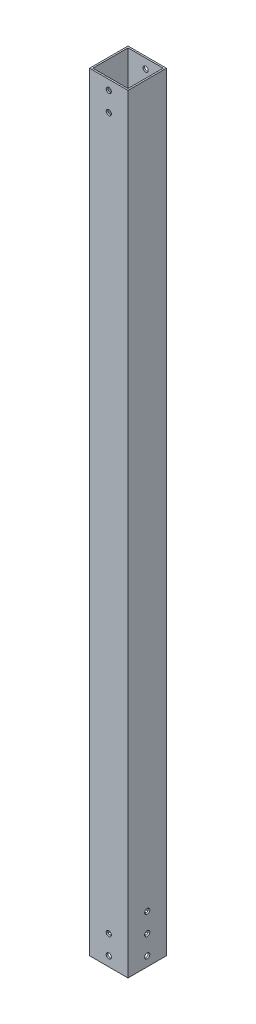
ISO-10303-21;
HEADER;
FILE_DESCRIPTION(('STEP AP214'),'2;1');
FILE_NAME('part.step','',(''),(''),'','','');
FILE_SCHEMA(('AUTOMOTIVE_DESIGN { 1 0 10303 214 1 1 1 1 }'));
ENDSEC;
DATA;
#1=APPLICATION_CONTEXT('core data for automotive mechanical design processes');
#2=APPLICATION_PROTOCOL_DEFINITION('international standard','automotive_design',2000,#1);
#3=PRODUCT_CONTEXT('',#1,'mechanical');
#4=PRODUCT('Part','Part','',(#3));
#5=PRODUCT_RELATED_PRODUCT_CATEGORY('part','',(#4));
#6=PRODUCT_DEFINITION_FORMATION('','',#4);
#7=PRODUCT_DEFINITION_CONTEXT('part definition',#1,'design');
#8=PRODUCT_DEFINITION('design','',#6,#7);
#9=PRODUCT_DEFINITION_SHAPE('','',#8);
#10=(LENGTH_UNIT() NAMED_UNIT(*) SI_UNIT(.MILLI.,.METRE.));
#11=(NAMED_UNIT(*) PLANE_ANGLE_UNIT() SI_UNIT($,.RADIAN.));
#12=(NAMED_UNIT(*) SI_UNIT($,.STERADIAN.) SOLID_ANGLE_UNIT());
#13=UNCERTAINTY_MEASURE_WITH_UNIT(LENGTH_MEASURE(1.E-05),#10,'distance_accuracy_value','');
#14=(GEOMETRIC_REPRESENTATION_CONTEXT(3) GLOBAL_UNCERTAINTY_ASSIGNED_CONTEXT((#13)) GLOBAL_UNIT_ASSIGNED_CONTEXT((#10,
#11,#12)) REPRESENTATION_CONTEXT('',''));
#15=CARTESIAN_POINT('',(0.,0.,0.));
#16=DIRECTION('',(0.,0.,1.));
#17=DIRECTION('',(1.,0.,0.));
#18=AXIS2_PLACEMENT_3D('',#15,#16,#17);
#19=CARTESIAN_POINT('',(-19.05,47.625,0.));
#20=DIRECTION('',(1.,0.,0.));
#21=DIRECTION('',(0.,0.,-1.));
#22=AXIS2_PLACEMENT_3D('',#19,#20,#21);
#23=CYLINDRICAL_SURFACE('',#22,2.5527);
#24=CARTESIAN_POINT('',(-17.4625,47.625,0.));
#25=DIRECTION('',(1.,0.,0.));
#26=DIRECTION('',(0.,0.,-1.));
#27=AXIS2_PLACEMENT_3D('',#24,#25,#26);
#28=CIRCLE('',#27,2.5527);
#29=CARTESIAN_POINT('',(-17.4625,47.625,-2.5527));
#30=VERTEX_POINT('',#29);
#31=EDGE_CURVE('E315',#30,#30,#28,.T.);
#32=ORIENTED_EDGE('',*,*,#31,.T.);
#33=EDGE_LOOP('',(#32));
#34=FACE_BOUND('',#33,.T.);
#35=CARTESIAN_POINT('',(-19.05,47.625,0.));
#36=DIRECTION('',(1.,0.,0.));
#37=DIRECTION('',(0.,0.,-1.));
#38=AXIS2_PLACEMENT_3D('',#35,#36,#37);
#39=CIRCLE('',#38,2.5527);
#40=CARTESIAN_POINT('',(-19.05,47.625,-2.5527));
#41=VERTEX_POINT('',#40);
#42=EDGE_CURVE('E312',#41,#41,#39,.T.);
#43=ORIENTED_EDGE('',*,*,#42,.F.);
#44=EDGE_LOOP('',(#43));
#45=FACE_BOUND('',#44,.T.);
#46=ADVANCED_FACE('F16',(#34,#45),#23,.F.);
#47=CARTESIAN_POINT('',(-19.05,47.625,0.));
#48=DIRECTION('',(1.,0.,0.));
#49=DIRECTION('',(0.,0.,-1.));
#50=AXIS2_PLACEMENT_3D('',#47,#48,#49);
#51=CYLINDRICAL_SURFACE('',#50,2.5527);
#52=CARTESIAN_POINT('',(17.4625,47.625,0.));
#53=DIRECTION('',(-1.,0.,0.));
#54=DIRECTION('',(0.,0.,1.));
#55=AXIS2_PLACEMENT_3D('',#52,#53,#54);
#56=CIRCLE('',#55,2.5527);
#57=CARTESIAN_POINT('',(17.4625,47.625,2.5527));
#58=VERTEX_POINT('',#57);
#59=EDGE_CURVE('E216',#58,#58,#56,.T.);
#60=ORIENTED_EDGE('',*,*,#59,.T.);
#61=EDGE_LOOP('',(#60));
#62=FACE_BOUND('',#61,.T.);
#63=CARTESIAN_POINT('',(19.05,47.625,0.));
#64=DIRECTION('',(1.,0.,0.));
#65=DIRECTION('',(0.,0.,-1.));
#66=AXIS2_PLACEMENT_3D('',#63,#64,#65);
#67=CIRCLE('',#66,2.5527);
#68=CARTESIAN_POINT('',(19.05,47.625,-2.5527));
#69=VERTEX_POINT('',#68);
#70=EDGE_CURVE('E241',#69,#69,#67,.T.);
#71=ORIENTED_EDGE('',*,*,#70,.T.);
#72=EDGE_LOOP('',(#71));
#73=FACE_BOUND('',#72,.T.);
#74=ADVANCED_FACE('F621',(#62,#73),#51,.F.);
#75=CARTESIAN_POINT('',(0.,752.475,-19.05));
#76=DIRECTION('',(0.,0.,1.));
#77=DIRECTION('',(1.,0.,0.));
#78=AXIS2_PLACEMENT_3D('',#75,#76,#77);
#79=CYLINDRICAL_SURFACE('',#78,2.55270000000004);
#80=CARTESIAN_POINT('',(0.,752.475,-17.4625));
#81=DIRECTION('',(0.,0.,1.));
#82=DIRECTION('',(1.,0.,0.));
#83=AXIS2_PLACEMENT_3D('',#80,#81,#82);
#84=CIRCLE('',#83,2.55270000000004);
#85=CARTESIAN_POINT('',(2.55270000000004,752.475,-17.4625));
#86=VERTEX_POINT('',#85);
#87=EDGE_CURVE('E252',#86,#86,#84,.T.);
#88=ORIENTED_EDGE('',*,*,#87,.T.);
#89=EDGE_LOOP('',(#88));
#90=FACE_BOUND('',#89,.T.);
#91=CARTESIAN_POINT('',(0.,752.475,-19.05));
#92=DIRECTION('',(0.,0.,1.));
#93=DIRECTION('',(1.,0.,0.));
#94=AXIS2_PLACEMENT_3D('',#91,#92,#93);
#95=CIRCLE('',#94,2.55270000000004);
#96=CARTESIAN_POINT('',(2.55270000000004,752.475,-19.05));
#97=VERTEX_POINT('',#96);
#98=EDGE_CURVE('E291',#97,#97,#95,.T.);
#99=ORIENTED_EDGE('',*,*,#98,.F.);
#100=EDGE_LOOP('',(#99));
#101=FACE_BOUND('',#100,.T.);
#102=ADVANCED_FACE('F417',(#90,#101),#79,.F.);
#103=CARTESIAN_POINT('',(0.,733.425,-19.05));
#104=DIRECTION('',(0.,0.,1.));
#105=DIRECTION('',(1.,0.,0.));
#106=AXIS2_PLACEMENT_3D('',#103,#104,#105);
#107=CYLINDRICAL_SURFACE('',#106,2.55270000000004);
#108=CARTESIAN_POINT('',(0.,733.425,-17.4625));
#109=DIRECTION('',(0.,0.,1.));
#110=DIRECTION('',(1.,0.,0.));
#111=AXIS2_PLACEMENT_3D('',#108,#109,#110);
#112=CIRCLE('',#111,2.55270000000004);
#113=CARTESIAN_POINT('',(2.55270000000004,733.425,-17.4625));
#114=VERTEX_POINT('',#113);
#115=EDGE_CURVE('E326',#114,#114,#112,.T.);
#116=ORIENTED_EDGE('',*,*,#115,.T.);
#117=EDGE_LOOP('',(#116));
#118=FACE_BOUND('',#117,.T.);
#119=CARTESIAN_POINT('',(0.,733.425,-19.05));
#120=DIRECTION('',(0.,0.,1.));
#121=DIRECTION('',(1.,0.,0.));
#122=AXIS2_PLACEMENT_3D('',#119,#120,#121);
#123=CIRCLE('',#122,2.55270000000004);
#124=CARTESIAN_POINT('',(2.55270000000004,733.425,-19.05));
#125=VERTEX_POINT('',#124);
#126=EDGE_CURVE('E283',#125,#125,#123,.T.);
#127=ORIENTED_EDGE('',*,*,#126,.F.);
#128=EDGE_LOOP('',(#127));
#129=FACE_BOUND('',#128,.T.);
#130=ADVANCED_FACE('F18',(#118,#129),#107,.F.);
#131=CARTESIAN_POINT('',(0.,752.475,-19.05));
#132=DIRECTION('',(0.,0.,1.));
#133=DIRECTION('',(1.,0.,0.));
#134=AXIS2_PLACEMENT_3D('',#131,#132,#133);
#135=CYLINDRICAL_SURFACE('',#134,2.55270000000004);
#136=CARTESIAN_POINT('',(0.,752.475,17.4625));
#137=DIRECTION('',(0.,0.,-1.));
#138=DIRECTION('',(-1.,0.,0.));
#139=AXIS2_PLACEMENT_3D('',#136,#137,#138);
#140=CIRCLE('',#139,2.55270000000004);
#141=CARTESIAN_POINT('',(-2.55270000000005,752.475,17.4625));
#142=VERTEX_POINT('',#141);
#143=EDGE_CURVE('E354',#142,#142,#140,.T.);
#144=ORIENTED_EDGE('',*,*,#143,.T.);
#145=EDGE_LOOP('',(#144));
#146=FACE_BOUND('',#145,.T.);
#147=CARTESIAN_POINT('',(0.,752.475,19.05));
#148=DIRECTION('',(0.,0.,1.));
#149=DIRECTION('',(1.,0.,0.));
#150=AXIS2_PLACEMENT_3D('',#147,#148,#149);
#151=CIRCLE('',#150,2.55270000000004);
#152=CARTESIAN_POINT('',(2.55270000000004,752.475,19.05));
#153=VERTEX_POINT('',#152);
#154=EDGE_CURVE('E257',#153,#153,#151,.T.);
#155=ORIENTED_EDGE('',*,*,#154,.T.);
#156=EDGE_LOOP('',(#155));
#157=FACE_BOUND('',#156,.T.);
#158=ADVANCED_FACE('F416',(#146,#157),#135,.F.);
#159=CARTESIAN_POINT('',(0.,733.425,-19.05));
#160=DIRECTION('',(0.,0.,1.));
#161=DIRECTION('',(1.,0.,0.));
#162=AXIS2_PLACEMENT_3D('',#159,#160,#161);
#163=CYLINDRICAL_SURFACE('',#162,2.55270000000004);
#164=CARTESIAN_POINT('',(0.,733.425,17.4625));
#165=DIRECTION('',(0.,0.,-1.));
#166=DIRECTION('',(-1.,0.,0.));
#167=AXIS2_PLACEMENT_3D('',#164,#165,#166);
#168=CIRCLE('',#167,2.55270000000004);
#169=CARTESIAN_POINT('',(-2.55270000000005,733.425,17.4625));
#170=VERTEX_POINT('',#169);
#171=EDGE_CURVE('E226',#170,#170,#168,.T.);
#172=ORIENTED_EDGE('',*,*,#171,.T.);
#173=EDGE_LOOP('',(#172));
#174=FACE_BOUND('',#173,.T.);
#175=CARTESIAN_POINT('',(0.,733.425,19.05));
#176=DIRECTION('',(0.,0.,1.));
#177=DIRECTION('',(1.,0.,0.));
#178=AXIS2_PLACEMENT_3D('',#175,#176,#177);
#179=CIRCLE('',#178,2.55270000000004);
#180=CARTESIAN_POINT('',(2.55270000000004,733.425,19.05));
#181=VERTEX_POINT('',#180);
#182=EDGE_CURVE('E333',#181,#181,#179,.T.);
#183=ORIENTED_EDGE('',*,*,#182,.T.);
#184=EDGE_LOOP('',(#183));
#185=FACE_BOUND('',#184,.T.);
#186=ADVANCED_FACE('F489',(#174,#185),#163,.F.);
#187=CARTESIAN_POINT('',(0.,28.575,-19.05));
#188=DIRECTION('',(0.,0.,1.));
#189=DIRECTION('',(1.,0.,0.));
#190=AXIS2_PLACEMENT_3D('',#187,#188,#189);
#191=CYLINDRICAL_SURFACE('',#190,2.5527);
#192=CARTESIAN_POINT('',(0.,28.575,-17.4625));
#193=DIRECTION('',(0.,0.,-1.));
#194=DIRECTION('',(1.,0.,0.));
#195=AXIS2_PLACEMENT_3D('',#192,#193,#194);
#196=CIRCLE('',#195,2.5527);
#197=CARTESIAN_POINT('',(2.5527,28.575,-17.4625));
#198=VERTEX_POINT('',#197);
#199=EDGE_CURVE('E338',#198,#198,#196,.T.);
#200=ORIENTED_EDGE('',*,*,#199,.F.);
#201=EDGE_LOOP('',(#200));
#202=FACE_BOUND('',#201,.T.);
#203=CARTESIAN_POINT('',(0.,28.575,-19.05));
#204=DIRECTION('',(0.,0.,-1.));
#205=DIRECTION('',(-1.,0.,0.));
#206=AXIS2_PLACEMENT_3D('',#203,#204,#205);
#207=CIRCLE('',#206,2.5527);
#208=CARTESIAN_POINT('',(-2.5527,28.575,-19.05));
#209=VERTEX_POINT('',#208);
#210=EDGE_CURVE('E279',#209,#209,#207,.T.);
#211=ORIENTED_EDGE('',*,*,#210,.T.);
#212=EDGE_LOOP('',(#211));
#213=FACE_BOUND('',#212,.T.);
#214=ADVANCED_FACE('F478',(#202,#213),#191,.F.);
#215=CARTESIAN_POINT('',(0.,9.525,-19.05));
#216=DIRECTION('',(0.,0.,1.));
#217=DIRECTION('',(1.,0.,0.));
#218=AXIS2_PLACEMENT_3D('',#215,#216,#217);
#219=CYLINDRICAL_SURFACE('',#218,2.5527);
#220=CARTESIAN_POINT('',(0.,9.525,-17.4625));
#221=DIRECTION('',(0.,0.,-1.));
#222=DIRECTION('',(1.,0.,0.));
#223=AXIS2_PLACEMENT_3D('',#220,#221,#222);
#224=CIRCLE('',#223,2.5527);
#225=CARTESIAN_POINT('',(2.5527,9.525,-17.4625));
#226=VERTEX_POINT('',#225);
#227=EDGE_CURVE('E350',#226,#226,#224,.T.);
#228=ORIENTED_EDGE('',*,*,#227,.F.);
#229=EDGE_LOOP('',(#228));
#230=FACE_BOUND('',#229,.T.);
#231=CARTESIAN_POINT('',(0.,9.525,-19.05));
#232=DIRECTION('',(0.,0.,-1.));
#233=DIRECTION('',(-1.,0.,0.));
#234=AXIS2_PLACEMENT_3D('',#231,#232,#233);
#235=CIRCLE('',#234,2.5527);
#236=CARTESIAN_POINT('',(-2.5527,9.525,-19.05));
#237=VERTEX_POINT('',#236);
#238=EDGE_CURVE('E282',#237,#237,#235,.T.);
#239=ORIENTED_EDGE('',*,*,#238,.T.);
#240=EDGE_LOOP('',(#239));
#241=FACE_BOUND('',#240,.T.);
#242=ADVANCED_FACE('F443',(#230,#241),#219,.F.);
#243=CARTESIAN_POINT('',(0.,28.575,-19.05));
#244=DIRECTION('',(0.,0.,1.));
#245=DIRECTION('',(1.,0.,0.));
#246=AXIS2_PLACEMENT_3D('',#243,#244,#245);
#247=CYLINDRICAL_SURFACE('',#246,2.5527);
#248=CARTESIAN_POINT('',(0.,28.575,17.4625));
#249=DIRECTION('',(0.,0.,1.));
#250=DIRECTION('',(-1.,0.,0.));
#251=AXIS2_PLACEMENT_3D('',#248,#249,#250);
#252=CIRCLE('',#251,2.5527);
#253=CARTESIAN_POINT('',(-2.5527,28.575,17.4625));
#254=VERTEX_POINT('',#253);
#255=EDGE_CURVE('E217',#254,#254,#252,.T.);
#256=ORIENTED_EDGE('',*,*,#255,.F.);
#257=EDGE_LOOP('',(#256));
#258=FACE_BOUND('',#257,.T.);
#259=CARTESIAN_POINT('',(0.,28.575,19.05));
#260=DIRECTION('',(0.,0.,-1.));
#261=DIRECTION('',(-1.,0.,0.));
#262=AXIS2_PLACEMENT_3D('',#259,#260,#261);
#263=CIRCLE('',#262,2.5527);
#264=CARTESIAN_POINT('',(-2.5527,28.575,19.05));
#265=VERTEX_POINT('',#264);
#266=EDGE_CURVE('E260',#265,#265,#263,.T.);
#267=ORIENTED_EDGE('',*,*,#266,.F.);
#268=EDGE_LOOP('',(#267));
#269=FACE_BOUND('',#268,.T.);
#270=ADVANCED_FACE('F437',(#258,#269),#247,.F.);
#271=CARTESIAN_POINT('',(0.,9.525,-19.05));
#272=DIRECTION('',(0.,0.,1.));
#273=DIRECTION('',(1.,0.,0.));
#274=AXIS2_PLACEMENT_3D('',#271,#272,#273);
#275=CYLINDRICAL_SURFACE('',#274,2.5527);
#276=CARTESIAN_POINT('',(0.,9.525,17.4625));
#277=DIRECTION('',(0.,0.,1.));
#278=DIRECTION('',(-1.,0.,0.));
#279=AXIS2_PLACEMENT_3D('',#276,#277,#278);
#280=CIRCLE('',#279,2.5527);
#281=CARTESIAN_POINT('',(-2.5527,9.525,17.4625));
#282=VERTEX_POINT('',#281);
#283=EDGE_CURVE('E211',#282,#282,#280,.T.);
#284=ORIENTED_EDGE('',*,*,#283,.F.);
#285=EDGE_LOOP('',(#284));
#286=FACE_BOUND('',#285,.T.);
#287=CARTESIAN_POINT('',(0.,9.525,19.05));
#288=DIRECTION('',(0.,0.,-1.));
#289=DIRECTION('',(-1.,0.,0.));
#290=AXIS2_PLACEMENT_3D('',#287,#288,#289);
#291=CIRCLE('',#290,2.5527);
#292=CARTESIAN_POINT('',(-2.5527,9.525,19.05));
#293=VERTEX_POINT('',#292);
#294=EDGE_CURVE('E258',#293,#293,#291,.T.);
#295=ORIENTED_EDGE('',*,*,#294,.F.);
#296=EDGE_LOOP('',(#295));
#297=FACE_BOUND('',#296,.T.);
#298=ADVANCED_FACE('F442',(#286,#297),#275,.F.);
#299=CARTESIAN_POINT('',(-19.05,28.575,0.));
#300=DIRECTION('',(1.,0.,0.));
#301=DIRECTION('',(0.,0.,-1.));
#302=AXIS2_PLACEMENT_3D('',#299,#300,#301);
#303=CYLINDRICAL_SURFACE('',#302,2.5527);
#304=CARTESIAN_POINT('',(-17.4625,28.575,0.));
#305=DIRECTION('',(1.,0.,0.));
#306=DIRECTION('',(0.,0.,-1.));
#307=AXIS2_PLACEMENT_3D('',#304,#305,#306);
#308=CIRCLE('',#307,2.5527);
#309=CARTESIAN_POINT('',(-17.4625,28.575,-2.5527));
#310=VERTEX_POINT('',#309);
#311=EDGE_CURVE('E249',#310,#310,#308,.T.);
#312=ORIENTED_EDGE('',*,*,#311,.T.);
#313=EDGE_LOOP('',(#312));
#314=FACE_BOUND('',#313,.T.);
#315=CARTESIAN_POINT('',(-19.05,28.575,0.));
#316=DIRECTION('',(1.,0.,0.));
#317=DIRECTION('',(0.,0.,-1.));
#318=AXIS2_PLACEMENT_3D('',#315,#316,#317);
#319=CIRCLE('',#318,2.5527);
#320=CARTESIAN_POINT('',(-19.05,28.575,-2.5527));
#321=VERTEX_POINT('',#320);
#322=EDGE_CURVE('E20',#321,#321,#319,.T.);
#323=ORIENTED_EDGE('',*,*,#322,.F.);
#324=EDGE_LOOP('',(#323));
#325=FACE_BOUND('',#324,.T.);
#326=ADVANCED_FACE('F455',(#314,#325),#303,.F.);
#327=CARTESIAN_POINT('',(-19.05,9.525,0.));
#328=DIRECTION('',(1.,0.,0.));
#329=DIRECTION('',(0.,0.,-1.));
#330=AXIS2_PLACEMENT_3D('',#327,#328,#329);
#331=CYLINDRICAL_SURFACE('',#330,2.5527);
#332=CARTESIAN_POINT('',(-17.4625,9.525,0.));
#333=DIRECTION('',(1.,0.,0.));
#334=DIRECTION('',(0.,0.,-1.));
#335=AXIS2_PLACEMENT_3D('',#332,#333,#334);
#336=CIRCLE('',#335,2.5527);
#337=CARTESIAN_POINT('',(-17.4625,9.525,-2.5527));
#338=VERTEX_POINT('',#337);
#339=EDGE_CURVE('E246',#338,#338,#336,.T.);
#340=ORIENTED_EDGE('',*,*,#339,.T.);
#341=EDGE_LOOP('',(#340));
#342=FACE_BOUND('',#341,.T.);
#343=CARTESIAN_POINT('',(-19.05,9.525,0.));
#344=DIRECTION('',(1.,0.,0.));
#345=DIRECTION('',(0.,0.,-1.));
#346=AXIS2_PLACEMENT_3D('',#343,#344,#345);
#347=CIRCLE('',#346,2.5527);
#348=CARTESIAN_POINT('',(-19.05,9.525,-2.5527));
#349=VERTEX_POINT('',#348);
#350=EDGE_CURVE('E254',#349,#349,#347,.T.);
#351=ORIENTED_EDGE('',*,*,#350,.F.);
#352=EDGE_LOOP('',(#351));
#353=FACE_BOUND('',#352,.T.);
#354=ADVANCED_FACE('F569',(#342,#353),#331,.F.);
#355=CARTESIAN_POINT('',(-19.05,28.575,0.));
#356=DIRECTION('',(1.,0.,0.));
#357=DIRECTION('',(0.,0.,-1.));
#358=AXIS2_PLACEMENT_3D('',#355,#356,#357);
#359=CYLINDRICAL_SURFACE('',#358,2.5527);
#360=CARTESIAN_POINT('',(17.4625,28.575,0.));
#361=DIRECTION('',(-1.,0.,0.));
#362=DIRECTION('',(0.,0.,1.));
#363=AXIS2_PLACEMENT_3D('',#360,#361,#362);
#364=CIRCLE('',#363,2.5527);
#365=CARTESIAN_POINT('',(17.4625,28.575,2.5527));
#366=VERTEX_POINT('',#365);
#367=EDGE_CURVE('E27',#366,#366,#364,.T.);
#368=ORIENTED_EDGE('',*,*,#367,.T.);
#369=EDGE_LOOP('',(#368));
#370=FACE_BOUND('',#369,.T.);
#371=CARTESIAN_POINT('',(19.05,28.575,0.));
#372=DIRECTION('',(1.,0.,0.));
#373=DIRECTION('',(0.,0.,-1.));
#374=AXIS2_PLACEMENT_3D('',#371,#372,#373);
#375=CIRCLE('',#374,2.5527);
#376=CARTESIAN_POINT('',(19.05,28.575,-2.5527));
#377=VERTEX_POINT('',#376);
#378=EDGE_CURVE('E244',#377,#377,#375,.T.);
#379=ORIENTED_EDGE('',*,*,#378,.T.);
#380=EDGE_LOOP('',(#379));
#381=FACE_BOUND('',#380,.T.);
#382=ADVANCED_FACE('F523',(#370,#381),#359,.F.);
#383=CARTESIAN_POINT('',(-19.05,9.525,0.));
#384=DIRECTION('',(1.,0.,0.));
#385=DIRECTION('',(0.,0.,-1.));
#386=AXIS2_PLACEMENT_3D('',#383,#384,#385);
#387=CYLINDRICAL_SURFACE('',#386,2.5527);
#388=CARTESIAN_POINT('',(17.4625,9.525,0.));
#389=DIRECTION('',(-1.,0.,0.));
#390=DIRECTION('',(0.,0.,1.));
#391=AXIS2_PLACEMENT_3D('',#388,#389,#390);
#392=CIRCLE('',#391,2.5527);
#393=CARTESIAN_POINT('',(17.4625,9.525,2.5527));
#394=VERTEX_POINT('',#393);
#395=EDGE_CURVE('E11',#394,#394,#392,.T.);
#396=ORIENTED_EDGE('',*,*,#395,.T.);
#397=EDGE_LOOP('',(#396));
#398=FACE_BOUND('',#397,.T.);
#399=CARTESIAN_POINT('',(19.05,9.525,0.));
#400=DIRECTION('',(1.,0.,0.));
#401=DIRECTION('',(0.,0.,-1.));
#402=AXIS2_PLACEMENT_3D('',#399,#400,#401);
#403=CIRCLE('',#402,2.5527);
#404=CARTESIAN_POINT('',(19.05,9.525,-2.5527));
#405=VERTEX_POINT('',#404);
#406=EDGE_CURVE('E329',#405,#405,#403,.T.);
#407=ORIENTED_EDGE('',*,*,#406,.T.);
#408=EDGE_LOOP('',(#407));
#409=FACE_BOUND('',#408,.T.);
#410=ADVANCED_FACE('F502',(#398,#409),#387,.F.);
#411=CARTESIAN_POINT('',(17.4625,762.,-17.4625));
#412=DIRECTION('',(-1.,0.,0.));
#413=DIRECTION('',(0.,1.,0.));
#414=AXIS2_PLACEMENT_3D('',#411,#412,#413);
#415=PLANE('',#414);
#416=ORIENTED_EDGE('',*,*,#395,.F.);
#417=EDGE_LOOP('',(#416));
#418=FACE_BOUND('',#417,.T.);
#419=ORIENTED_EDGE('',*,*,#367,.F.);
#420=EDGE_LOOP('',(#419));
#421=FACE_BOUND('',#420,.T.);
#422=ORIENTED_EDGE('',*,*,#59,.F.);
#423=EDGE_LOOP('',(#422));
#424=FACE_BOUND('',#423,.T.);
#425=DIRECTION('',(0.,0.,-1.));
#426=VECTOR('',#425,1.);
#427=CARTESIAN_POINT('',(17.4625,0.,-17.4625));
#428=LINE('',#427,#426);
#429=CARTESIAN_POINT('',(17.4625,0.,17.4625));
#430=VERTEX_POINT('',#429);
#431=CARTESIAN_POINT('',(17.4625,0.,-17.4625));
#432=VERTEX_POINT('',#431);
#433=EDGE_CURVE('E298',#430,#432,#428,.T.);
#434=ORIENTED_EDGE('',*,*,#433,.F.);
#435=DIRECTION('',(0.,-1.,0.));
#436=VECTOR('',#435,1.);
#437=CARTESIAN_POINT('',(17.4625,762.,17.4625));
#438=LINE('',#437,#436);
#439=CARTESIAN_POINT('',(17.4625,762.,17.4625));
#440=VERTEX_POINT('',#439);
#441=EDGE_CURVE('E230',#440,#430,#438,.T.);
#442=ORIENTED_EDGE('',*,*,#441,.F.);
#443=DIRECTION('',(0.,0.,-1.));
#444=VECTOR('',#443,1.);
#445=CARTESIAN_POINT('',(17.4625,762.,-17.4625));
#446=LINE('',#445,#444);
#447=CARTESIAN_POINT('',(17.4625,762.,-17.4625));
#448=VERTEX_POINT('',#447);
#449=EDGE_CURVE('E270',#440,#448,#446,.T.);
#450=ORIENTED_EDGE('',*,*,#449,.T.);
#451=DIRECTION('',(0.,-1.,0.));
#452=VECTOR('',#451,1.);
#453=CARTESIAN_POINT('',(17.4625,762.,-17.4625));
#454=LINE('',#453,#452);
#455=EDGE_CURVE('E253',#448,#432,#454,.T.);
#456=ORIENTED_EDGE('',*,*,#455,.T.);
#457=EDGE_LOOP('',(#434,#442,#450,#456));
#458=FACE_BOUND('',#457,.T.);
#459=ADVANCED_FACE('F497',(#418,#421,#424,#458),#415,.T.);
#460=CARTESIAN_POINT('',(-17.4625,762.,17.4625));
#461=DIRECTION('',(0.,0.,-1.));
#462=DIRECTION('',(0.,-1.,0.));
#463=AXIS2_PLACEMENT_3D('',#460,#461,#462);
#464=PLANE('',#463);
#465=ORIENTED_EDGE('',*,*,#283,.T.);
#466=EDGE_LOOP('',(#465));
#467=FACE_BOUND('',#466,.T.);
#468=ORIENTED_EDGE('',*,*,#255,.T.);
#469=EDGE_LOOP('',(#468));
#470=FACE_BOUND('',#469,.T.);
#471=ORIENTED_EDGE('',*,*,#171,.F.);
#472=EDGE_LOOP('',(#471));
#473=FACE_BOUND('',#472,.T.);
#474=ORIENTED_EDGE('',*,*,#143,.F.);
#475=EDGE_LOOP('',(#474));
#476=FACE_BOUND('',#475,.T.);
#477=DIRECTION('',(1.,0.,0.));
#478=VECTOR('',#477,1.);
#479=CARTESIAN_POINT('',(-17.4625,0.,17.4625));
#480=LINE('',#479,#478);
#481=CARTESIAN_POINT('',(-17.4625,0.,17.4625));
#482=VERTEX_POINT('',#481);
#483=EDGE_CURVE('E265',#482,#430,#480,.T.);
#484=ORIENTED_EDGE('',*,*,#483,.F.);
#485=DIRECTION('',(0.,-1.,0.));
#486=VECTOR('',#485,1.);
#487=CARTESIAN_POINT('',(-17.4625,762.,17.4625));
#488=LINE('',#487,#486);
#489=CARTESIAN_POINT('',(-17.4625,762.,17.4625));
#490=VERTEX_POINT('',#489);
#491=EDGE_CURVE('E317',#490,#482,#488,.T.);
#492=ORIENTED_EDGE('',*,*,#491,.F.);
#493=DIRECTION('',(1.,0.,0.));
#494=VECTOR('',#493,1.);
#495=CARTESIAN_POINT('',(-17.4625,762.,17.4625));
#496=LINE('',#495,#494);
#497=EDGE_CURVE('E308',#490,#440,#496,.T.);
#498=ORIENTED_EDGE('',*,*,#497,.T.);
#499=ORIENTED_EDGE('',*,*,#441,.T.);
#500=EDGE_LOOP('',(#484,#492,#498,#499));
#501=FACE_BOUND('',#500,.T.);
#502=ADVANCED_FACE('F212',(#467,#470,#473,#476,#501),#464,.T.);
#503=CARTESIAN_POINT('',(-17.4625,762.,-17.4625));
#504=DIRECTION('',(1.,0.,0.));
#505=DIRECTION('',(0.,0.,-1.));
#506=AXIS2_PLACEMENT_3D('',#503,#504,#505);
#507=PLANE('',#506);
#508=ORIENTED_EDGE('',*,*,#339,.F.);
#509=EDGE_LOOP('',(#508));
#510=FACE_BOUND('',#509,.T.);
#511=ORIENTED_EDGE('',*,*,#311,.F.);
#512=EDGE_LOOP('',(#511));
#513=FACE_BOUND('',#512,.T.);
#514=ORIENTED_EDGE('',*,*,#31,.F.);
#515=EDGE_LOOP('',(#514));
#516=FACE_BOUND('',#515,.T.);
#517=DIRECTION('',(0.,0.,1.));
#518=VECTOR('',#517,1.);
#519=CARTESIAN_POINT('',(-17.4625,0.,-17.4625));
#520=LINE('',#519,#518);
#521=CARTESIAN_POINT('',(-17.4625,0.,-17.4625));
#522=VERTEX_POINT('',#521);
#523=EDGE_CURVE('E261',#522,#482,#520,.T.);
#524=ORIENTED_EDGE('',*,*,#523,.F.);
#525=DIRECTION('',(0.,-1.,0.));
#526=VECTOR('',#525,1.);
#527=CARTESIAN_POINT('',(-17.4625,762.,-17.4625));
#528=LINE('',#527,#526);
#529=CARTESIAN_POINT('',(-17.4625,762.,-17.4625));
#530=VERTEX_POINT('',#529);
#531=EDGE_CURVE('E130',#530,#522,#528,.T.);
#532=ORIENTED_EDGE('',*,*,#531,.F.);
#533=DIRECTION('',(0.,0.,1.));
#534=VECTOR('',#533,1.);
#535=CARTESIAN_POINT('',(-17.4625,762.,-17.4625));
#536=LINE('',#535,#534);
#537=EDGE_CURVE('E271',#530,#490,#536,.T.);
#538=ORIENTED_EDGE('',*,*,#537,.T.);
#539=ORIENTED_EDGE('',*,*,#491,.T.);
#540=EDGE_LOOP('',(#524,#532,#538,#539));
#541=FACE_BOUND('',#540,.T.);
#542=ADVANCED_FACE('F467',(#510,#513,#516,#541),#507,.T.);
#543=CARTESIAN_POINT('',(-17.4625,762.,-17.4625));
#544=DIRECTION('',(0.,0.,1.));
#545=DIRECTION('',(1.,0.,0.));
#546=AXIS2_PLACEMENT_3D('',#543,#544,#545);
#547=PLANE('',#546);
#548=ORIENTED_EDGE('',*,*,#227,.T.);
#549=EDGE_LOOP('',(#548));
#550=FACE_BOUND('',#549,.T.);
#551=ORIENTED_EDGE('',*,*,#199,.T.);
#552=EDGE_LOOP('',(#551));
#553=FACE_BOUND('',#552,.T.);
#554=ORIENTED_EDGE('',*,*,#115,.F.);
#555=EDGE_LOOP('',(#554));
#556=FACE_BOUND('',#555,.T.);
#557=ORIENTED_EDGE('',*,*,#87,.F.);
#558=EDGE_LOOP('',(#557));
#559=FACE_BOUND('',#558,.T.);
#560=DIRECTION('',(-1.,0.,0.));
#561=VECTOR('',#560,1.);
#562=CARTESIAN_POINT('',(-17.4625,0.,-17.4625));
#563=LINE('',#562,#561);
#564=EDGE_CURVE('E266',#432,#522,#563,.T.);
#565=ORIENTED_EDGE('',*,*,#564,.F.);
#566=ORIENTED_EDGE('',*,*,#455,.F.);
#567=DIRECTION('',(-1.,0.,0.));
#568=VECTOR('',#567,1.);
#569=CARTESIAN_POINT('',(-17.4625,762.,-17.4625));
#570=LINE('',#569,#568);
#571=EDGE_CURVE('E267',#448,#530,#570,.T.);
#572=ORIENTED_EDGE('',*,*,#571,.T.);
#573=ORIENTED_EDGE('',*,*,#531,.T.);
#574=EDGE_LOOP('',(#565,#566,#572,#573));
#575=FACE_BOUND('',#574,.T.);
#576=ADVANCED_FACE('F462',(#550,#553,#556,#559,#575),#547,.T.);
#577=CARTESIAN_POINT('',(-19.05,762.,19.05));
#578=DIRECTION('',(0.,0.,-1.));
#579=DIRECTION('',(0.,-1.,0.));
#580=AXIS2_PLACEMENT_3D('',#577,#578,#579);
#581=PLANE('',#580);
#582=ORIENTED_EDGE('',*,*,#294,.T.);
#583=EDGE_LOOP('',(#582));
#584=FACE_BOUND('',#583,.T.);
#585=ORIENTED_EDGE('',*,*,#266,.T.);
#586=EDGE_LOOP('',(#585));
#587=FACE_BOUND('',#586,.T.);
#588=ORIENTED_EDGE('',*,*,#182,.F.);
#589=EDGE_LOOP('',(#588));
#590=FACE_BOUND('',#589,.T.);
#591=ORIENTED_EDGE('',*,*,#154,.F.);
#592=EDGE_LOOP('',(#591));
#593=FACE_BOUND('',#592,.T.);
#594=DIRECTION('',(1.,0.,0.));
#595=VECTOR('',#594,1.);
#596=CARTESIAN_POINT('',(-19.05,0.,19.05));
#597=LINE('',#596,#595);
#598=CARTESIAN_POINT('',(-19.05,0.,19.05));
#599=VERTEX_POINT('',#598);
#600=CARTESIAN_POINT('',(19.05,0.,19.05));
#601=VERTEX_POINT('',#600);
#602=EDGE_CURVE('E272',#599,#601,#597,.T.);
#603=ORIENTED_EDGE('',*,*,#602,.T.);
#604=DIRECTION('',(0.,-1.,0.));
#605=VECTOR('',#604,1.);
#606=CARTESIAN_POINT('',(19.05,762.,19.05));
#607=LINE('',#606,#605);
#608=CARTESIAN_POINT('',(19.05,762.,19.05));
#609=VERTEX_POINT('',#608);
#610=EDGE_CURVE('E245',#609,#601,#607,.T.);
#611=ORIENTED_EDGE('',*,*,#610,.F.);
#612=DIRECTION('',(1.,0.,0.));
#613=VECTOR('',#612,1.);
#614=CARTESIAN_POINT('',(-19.05,762.,19.05));
#615=LINE('',#614,#613);
#616=CARTESIAN_POINT('',(-19.05,762.,19.05));
#617=VERTEX_POINT('',#616);
#618=EDGE_CURVE('E287',#617,#609,#615,.T.);
#619=ORIENTED_EDGE('',*,*,#618,.F.);
#620=DIRECTION('',(0.,-1.,0.));
#621=VECTOR('',#620,1.);
#622=CARTESIAN_POINT('',(-19.05,762.,19.05));
#623=LINE('',#622,#621);
#624=EDGE_CURVE('E146',#617,#599,#623,.T.);
#625=ORIENTED_EDGE('',*,*,#624,.T.);
#626=EDGE_LOOP('',(#603,#611,#619,#625));
#627=FACE_BOUND('',#626,.T.);
#628=ADVANCED_FACE('F378',(#584,#587,#590,#593,#627),#581,.F.);
#629=CARTESIAN_POINT('',(-19.05,762.,-19.05));
#630=DIRECTION('',(1.,0.,0.));
#631=DIRECTION('',(0.,1.,0.));
#632=AXIS2_PLACEMENT_3D('',#629,#630,#631);
#633=PLANE('',#632);
#634=ORIENTED_EDGE('',*,*,#350,.T.);
#635=EDGE_LOOP('',(#634));
#636=FACE_BOUND('',#635,.T.);
#637=ORIENTED_EDGE('',*,*,#322,.T.);
#638=EDGE_LOOP('',(#637));
#639=FACE_BOUND('',#638,.T.);
#640=ORIENTED_EDGE('',*,*,#42,.T.);
#641=EDGE_LOOP('',(#640));
#642=FACE_BOUND('',#641,.T.);
#643=DIRECTION('',(0.,0.,1.));
#644=VECTOR('',#643,1.);
#645=CARTESIAN_POINT('',(-19.05,0.,-19.05));
#646=LINE('',#645,#644);
#647=CARTESIAN_POINT('',(-19.05,0.,-19.05));
#648=VERTEX_POINT('',#647);
#649=EDGE_CURVE('E275',#648,#599,#646,.T.);
#650=ORIENTED_EDGE('',*,*,#649,.T.);
#651=ORIENTED_EDGE('',*,*,#624,.F.);
#652=DIRECTION('',(0.,0.,1.));
#653=VECTOR('',#652,1.);
#654=CARTESIAN_POINT('',(-19.05,762.,-19.05));
#655=LINE('',#654,#653);
#656=CARTESIAN_POINT('',(-19.05,762.,-19.05));
#657=VERTEX_POINT('',#656);
#658=EDGE_CURVE('E236',#657,#617,#655,.T.);
#659=ORIENTED_EDGE('',*,*,#658,.F.);
#660=DIRECTION('',(0.,-1.,0.));
#661=VECTOR('',#660,1.);
#662=CARTESIAN_POINT('',(-19.05,762.,-19.05));
#663=LINE('',#662,#661);
#664=EDGE_CURVE('E294',#657,#648,#663,.T.);
#665=ORIENTED_EDGE('',*,*,#664,.T.);
#666=EDGE_LOOP('',(#650,#651,#659,#665));
#667=FACE_BOUND('',#666,.T.);
#668=ADVANCED_FACE('F389',(#636,#639,#642,#667),#633,.F.);
#669=CARTESIAN_POINT('',(-19.05,762.,-19.05));
#670=DIRECTION('',(0.,0.,1.));
#671=DIRECTION('',(1.,0.,0.));
#672=AXIS2_PLACEMENT_3D('',#669,#670,#671);
#673=PLANE('',#672);
#674=ORIENTED_EDGE('',*,*,#238,.F.);
#675=EDGE_LOOP('',(#674));
#676=FACE_BOUND('',#675,.T.);
#677=ORIENTED_EDGE('',*,*,#210,.F.);
#678=EDGE_LOOP('',(#677));
#679=FACE_BOUND('',#678,.T.);
#680=ORIENTED_EDGE('',*,*,#126,.T.);
#681=EDGE_LOOP('',(#680));
#682=FACE_BOUND('',#681,.T.);
#683=ORIENTED_EDGE('',*,*,#98,.T.);
#684=EDGE_LOOP('',(#683));
#685=FACE_BOUND('',#684,.T.);
#686=DIRECTION('',(-1.,0.,0.));
#687=VECTOR('',#686,1.);
#688=CARTESIAN_POINT('',(-19.05,0.,-19.05));
#689=LINE('',#688,#687);
#690=CARTESIAN_POINT('',(19.05,0.,-19.05));
#691=VERTEX_POINT('',#690);
#692=EDGE_CURVE('E290',#691,#648,#689,.T.);
#693=ORIENTED_EDGE('',*,*,#692,.T.);
#694=ORIENTED_EDGE('',*,*,#664,.F.);
#695=DIRECTION('',(-1.,0.,0.));
#696=VECTOR('',#695,1.);
#697=CARTESIAN_POINT('',(-19.05,762.,-19.05));
#698=LINE('',#697,#696);
#699=CARTESIAN_POINT('',(19.05,762.,-19.05));
#700=VERTEX_POINT('',#699);
#701=EDGE_CURVE('E232',#700,#657,#698,.T.);
#702=ORIENTED_EDGE('',*,*,#701,.F.);
#703=DIRECTION('',(0.,-1.,0.));
#704=VECTOR('',#703,1.);
#705=CARTESIAN_POINT('',(19.05,762.,-19.05));
#706=LINE('',#705,#704);
#707=EDGE_CURVE('E302',#700,#691,#706,.T.);
#708=ORIENTED_EDGE('',*,*,#707,.T.);
#709=EDGE_LOOP('',(#693,#694,#702,#708));
#710=FACE_BOUND('',#709,.T.);
#711=ADVANCED_FACE('F384',(#676,#679,#682,#685,#710),#673,.F.);
#712=CARTESIAN_POINT('',(19.05,762.,-19.05));
#713=DIRECTION('',(-1.,0.,0.));
#714=DIRECTION('',(0.,1.,0.));
#715=AXIS2_PLACEMENT_3D('',#712,#713,#714);
#716=PLANE('',#715);
#717=ORIENTED_EDGE('',*,*,#406,.F.);
#718=EDGE_LOOP('',(#717));
#719=FACE_BOUND('',#718,.T.);
#720=ORIENTED_EDGE('',*,*,#378,.F.);
#721=EDGE_LOOP('',(#720));
#722=FACE_BOUND('',#721,.T.);
#723=ORIENTED_EDGE('',*,*,#70,.F.);
#724=EDGE_LOOP('',(#723));
#725=FACE_BOUND('',#724,.T.);
#726=DIRECTION('',(0.,0.,-1.));
#727=VECTOR('',#726,1.);
#728=CARTESIAN_POINT('',(19.05,0.,-19.05));
#729=LINE('',#728,#727);
#730=EDGE_CURVE('E276',#601,#691,#729,.T.);
#731=ORIENTED_EDGE('',*,*,#730,.T.);
#732=ORIENTED_EDGE('',*,*,#707,.F.);
#733=DIRECTION('',(0.,0.,-1.));
#734=VECTOR('',#733,1.);
#735=CARTESIAN_POINT('',(19.05,762.,-19.05));
#736=LINE('',#735,#734);
#737=EDGE_CURVE('E237',#609,#700,#736,.T.);
#738=ORIENTED_EDGE('',*,*,#737,.F.);
#739=ORIENTED_EDGE('',*,*,#610,.T.);
#740=EDGE_LOOP('',(#731,#732,#738,#739));
#741=FACE_BOUND('',#740,.T.);
#742=ADVANCED_FACE('F374',(#719,#722,#725,#741),#716,.F.);
#743=CARTESIAN_POINT('',(0.,0.,0.));
#744=DIRECTION('',(0.,1.,0.));
#745=DIRECTION('',(1.,0.,0.));
#746=AXIS2_PLACEMENT_3D('',#743,#744,#745);
#747=PLANE('',#746);
#748=ORIENTED_EDGE('',*,*,#564,.T.);
#749=ORIENTED_EDGE('',*,*,#523,.T.);
#750=ORIENTED_EDGE('',*,*,#483,.T.);
#751=ORIENTED_EDGE('',*,*,#433,.T.);
#752=EDGE_LOOP('',(#748,#749,#750,#751));
#753=FACE_BOUND('',#752,.T.);
#754=ORIENTED_EDGE('',*,*,#730,.F.);
#755=ORIENTED_EDGE('',*,*,#602,.F.);
#756=ORIENTED_EDGE('',*,*,#649,.F.);
#757=ORIENTED_EDGE('',*,*,#692,.F.);
#758=EDGE_LOOP('',(#754,#755,#756,#757));
#759=FACE_BOUND('',#758,.T.);
#760=ADVANCED_FACE('F382',(#753,#759),#747,.F.);
#761=CARTESIAN_POINT('',(0.,762.,0.));
#762=DIRECTION('',(0.,1.,0.));
#763=DIRECTION('',(1.,0.,0.));
#764=AXIS2_PLACEMENT_3D('',#761,#762,#763);
#765=PLANE('',#764);
#766=ORIENTED_EDGE('',*,*,#537,.F.);
#767=ORIENTED_EDGE('',*,*,#571,.F.);
#768=ORIENTED_EDGE('',*,*,#449,.F.);
#769=ORIENTED_EDGE('',*,*,#497,.F.);
#770=EDGE_LOOP('',(#766,#767,#768,#769));
#771=FACE_BOUND('',#770,.T.);
#772=ORIENTED_EDGE('',*,*,#737,.T.);
#773=ORIENTED_EDGE('',*,*,#701,.T.);
#774=ORIENTED_EDGE('',*,*,#658,.T.);
#775=ORIENTED_EDGE('',*,*,#618,.T.);
#776=EDGE_LOOP('',(#772,#773,#774,#775));
#777=FACE_BOUND('',#776,.T.);
#778=ADVANCED_FACE('F391',(#771,#777),#765,.T.);
#779=CLOSED_SHELL('',(#46,#74,#102,#130,#158,#186,#214,#242,#270,#298,#326,#354,#382,#410,#459,
#502,#542,#576,#628,#668,#711,#742,#760,#778));
#780=MANIFOLD_SOLID_BREP('B1',#779);
#781=ADVANCED_BREP_SHAPE_REPRESENTATION('',(#18,#780),#14);
#782=SHAPE_DEFINITION_REPRESENTATION(#9,#781);
ENDSEC;
END-ISO-10303-21;
